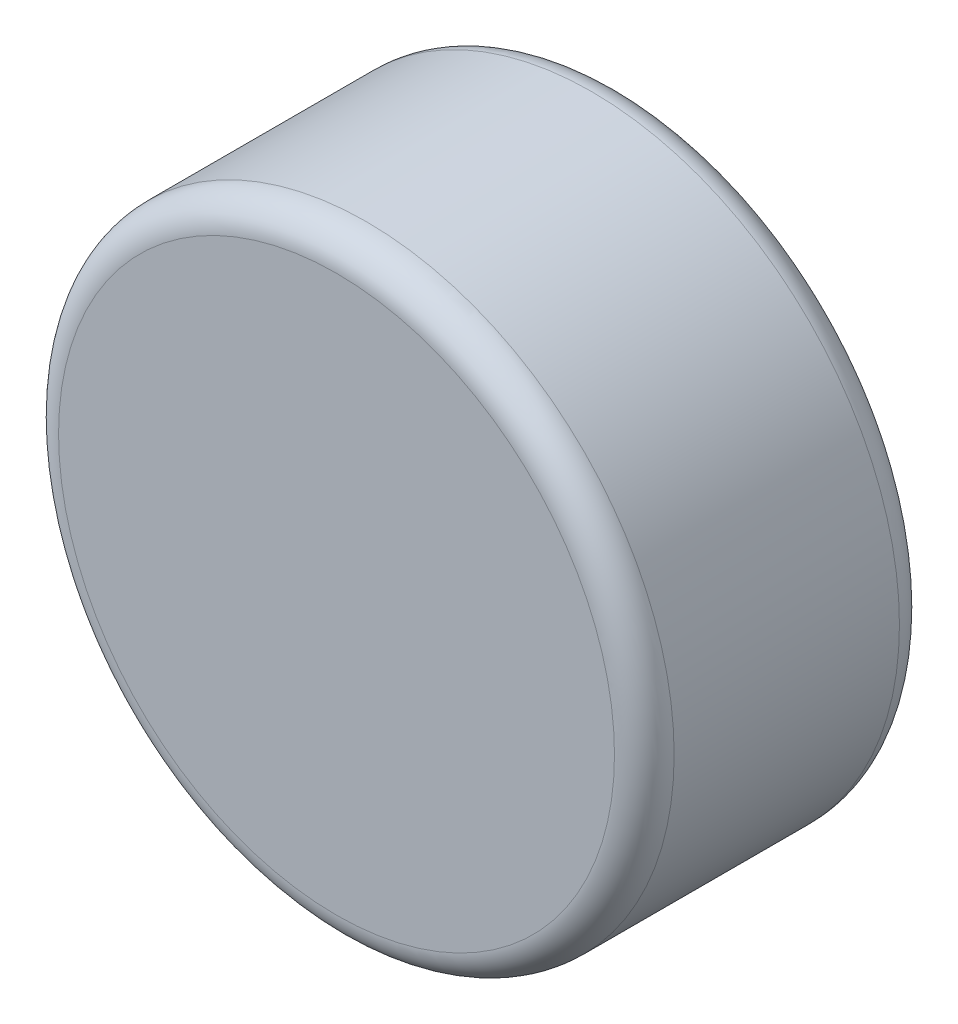
ISO-10303-21;
HEADER;
FILE_DESCRIPTION(('STEP AP214'),'2;1');
FILE_NAME('part.step','',(''),(''),'','','');
FILE_SCHEMA(('AUTOMOTIVE_DESIGN { 1 0 10303 214 1 1 1 1 }'));
ENDSEC;
DATA;
#1=APPLICATION_CONTEXT('core data for automotive mechanical design processes');
#2=APPLICATION_PROTOCOL_DEFINITION('international standard','automotive_design',2000,#1);
#3=PRODUCT_CONTEXT('',#1,'mechanical');
#4=PRODUCT('Part','Part','',(#3));
#5=PRODUCT_RELATED_PRODUCT_CATEGORY('part','',(#4));
#6=PRODUCT_DEFINITION_FORMATION('','',#4);
#7=PRODUCT_DEFINITION_CONTEXT('part definition',#1,'design');
#8=PRODUCT_DEFINITION('design','',#6,#7);
#9=PRODUCT_DEFINITION_SHAPE('','',#8);
#10=(LENGTH_UNIT() NAMED_UNIT(*) SI_UNIT(.MILLI.,.METRE.));
#11=(NAMED_UNIT(*) PLANE_ANGLE_UNIT() SI_UNIT($,.RADIAN.));
#12=(NAMED_UNIT(*) SI_UNIT($,.STERADIAN.) SOLID_ANGLE_UNIT());
#13=UNCERTAINTY_MEASURE_WITH_UNIT(LENGTH_MEASURE(1.E-05),#10,'distance_accuracy_value','');
#14=(GEOMETRIC_REPRESENTATION_CONTEXT(3) GLOBAL_UNCERTAINTY_ASSIGNED_CONTEXT((#13)) GLOBAL_UNIT_ASSIGNED_CONTEXT((#10,
#11,#12)) REPRESENTATION_CONTEXT('',''));
#15=CARTESIAN_POINT('',(0.,0.,0.));
#16=DIRECTION('',(0.,0.,1.));
#17=DIRECTION('',(1.,0.,0.));
#18=AXIS2_PLACEMENT_3D('',#15,#16,#17);
#19=CARTESIAN_POINT('',(0.,0.,0.));
#20=DIRECTION('',(0.,0.,1.));
#21=DIRECTION('',(1.,0.,0.));
#22=AXIS2_PLACEMENT_3D('',#19,#20,#21);
#23=PLANE('',#22);
#24=CARTESIAN_POINT('',(0.,0.,0.));
#25=DIRECTION('',(0.,0.,1.));
#26=DIRECTION('',(1.,0.,0.));
#27=AXIS2_PLACEMENT_3D('',#24,#25,#26);
#28=CIRCLE('',#27,43.8);
#29=CARTESIAN_POINT('',(43.8,0.,0.));
#30=VERTEX_POINT('',#29);
#31=EDGE_CURVE('E54',#30,#30,#28,.T.);
#32=ORIENTED_EDGE('',*,*,#31,.T.);
#33=EDGE_LOOP('',(#32));
#34=FACE_BOUND('',#33,.T.);
#35=ADVANCED_FACE('F39',(#34),#23,.T.);
#36=CARTESIAN_POINT('',(0.,0.,0.));
#37=DIRECTION('',(0.,0.,1.));
#38=DIRECTION('',(1.,0.,0.));
#39=AXIS2_PLACEMENT_3D('',#36,#37,#38);
#40=CYLINDRICAL_SURFACE('',#39,48.5);
#41=CARTESIAN_POINT('',(0.,0.,-4.7));
#42=DIRECTION('',(0.,0.,1.));
#43=DIRECTION('',(1.,0.,0.));
#44=AXIS2_PLACEMENT_3D('',#41,#42,#43);
#45=CIRCLE('',#44,48.5);
#46=CARTESIAN_POINT('',(48.5,0.,-4.7));
#47=VERTEX_POINT('',#46);
#48=EDGE_CURVE('E46',#47,#47,#45,.F.);
#49=ORIENTED_EDGE('',*,*,#48,.T.);
#50=EDGE_LOOP('',(#49));
#51=FACE_BOUND('',#50,.T.);
#52=CARTESIAN_POINT('',(0.,0.,-40.2));
#53=DIRECTION('',(0.,0.,-1.));
#54=DIRECTION('',(-1.,0.,0.));
#55=AXIS2_PLACEMENT_3D('',#52,#53,#54);
#56=CIRCLE('',#55,48.5);
#57=CARTESIAN_POINT('',(-48.5,0.,-40.2));
#58=VERTEX_POINT('',#57);
#59=EDGE_CURVE('E50',#58,#58,#56,.F.);
#60=ORIENTED_EDGE('',*,*,#59,.T.);
#61=EDGE_LOOP('',(#60));
#62=FACE_BOUND('',#61,.T.);
#63=ADVANCED_FACE('F76',(#51,#62),#40,.T.);
#64=CARTESIAN_POINT('',(48.5,0.,-44.9));
#65=DIRECTION('',(0.,0.,-1.));
#66=DIRECTION('',(-1.,0.,0.));
#67=AXIS2_PLACEMENT_3D('',#64,#65,#66);
#68=PLANE('',#67);
#69=CARTESIAN_POINT('',(0.,0.,-44.9));
#70=DIRECTION('',(0.,0.,-1.));
#71=DIRECTION('',(-1.,0.,0.));
#72=AXIS2_PLACEMENT_3D('',#69,#70,#71);
#73=CIRCLE('',#72,43.8);
#74=CARTESIAN_POINT('',(-43.8,0.,-44.9));
#75=VERTEX_POINT('',#74);
#76=EDGE_CURVE('E10',#75,#75,#73,.T.);
#77=ORIENTED_EDGE('',*,*,#76,.T.);
#78=EDGE_LOOP('',(#77));
#79=FACE_BOUND('',#78,.T.);
#80=CARTESIAN_POINT('',(0.,0.,-44.9));
#81=DIRECTION('',(0.,0.,-1.));
#82=DIRECTION('',(-1.,0.,0.));
#83=AXIS2_PLACEMENT_3D('',#80,#81,#82);
#84=CIRCLE('',#83,4.125);
#85=CARTESIAN_POINT('',(-4.125,0.,-44.9));
#86=VERTEX_POINT('',#85);
#87=EDGE_CURVE('E60',#86,#86,#84,.T.);
#88=ORIENTED_EDGE('',*,*,#87,.F.);
#89=EDGE_LOOP('',(#88));
#90=FACE_BOUND('',#89,.T.);
#91=ADVANCED_FACE('F71',(#79,#90),#68,.T.);
#92=CARTESIAN_POINT('',(0.,0.,-18.5));
#93=DIRECTION('',(0.,0.,-1.));
#94=DIRECTION('',(-1.,0.,0.));
#95=AXIS2_PLACEMENT_3D('',#92,#93,#94);
#96=CYLINDRICAL_SURFACE('',#95,4.125);
#97=CARTESIAN_POINT('',(0.,0.,-18.5));
#98=DIRECTION('',(0.,0.,-1.));
#99=DIRECTION('',(-1.,0.,0.));
#100=AXIS2_PLACEMENT_3D('',#97,#98,#99);
#101=CIRCLE('',#100,4.125);
#102=CARTESIAN_POINT('',(-4.125,0.,-18.5));
#103=VERTEX_POINT('',#102);
#104=EDGE_CURVE('E59',#103,#103,#101,.T.);
#105=ORIENTED_EDGE('',*,*,#104,.F.);
#106=EDGE_LOOP('',(#105));
#107=FACE_BOUND('',#106,.T.);
#108=ORIENTED_EDGE('',*,*,#87,.T.);
#109=EDGE_LOOP('',(#108));
#110=FACE_BOUND('',#109,.T.);
#111=ADVANCED_FACE('F68',(#107,#110),#96,.F.);
#112=CARTESIAN_POINT('',(0.,0.,-18.5));
#113=DIRECTION('',(0.,0.,-1.));
#114=DIRECTION('',(-1.,0.,0.));
#115=AXIS2_PLACEMENT_3D('',#112,#113,#114);
#116=PLANE('',#115);
#117=ORIENTED_EDGE('',*,*,#104,.T.);
#118=EDGE_LOOP('',(#117));
#119=FACE_BOUND('',#118,.T.);
#120=ADVANCED_FACE('F66',(#119),#116,.T.);
#121=CARTESIAN_POINT('',(0.,0.,-4.7));
#122=DIRECTION('',(0.,0.,1.));
#123=DIRECTION('',(1.,0.,0.));
#124=AXIS2_PLACEMENT_3D('',#121,#122,#123);
#125=TOROIDAL_SURFACE('',#124,43.8,4.7);
#126=ORIENTED_EDGE('',*,*,#48,.F.);
#127=EDGE_LOOP('',(#126));
#128=FACE_BOUND('',#127,.T.);
#129=ORIENTED_EDGE('',*,*,#31,.F.);
#130=EDGE_LOOP('',(#129));
#131=FACE_BOUND('',#130,.T.);
#132=ADVANCED_FACE('F89',(#128,#131),#125,.T.);
#133=CARTESIAN_POINT('',(0.,0.,-40.2));
#134=DIRECTION('',(0.,0.,-1.));
#135=DIRECTION('',(-1.,0.,0.));
#136=AXIS2_PLACEMENT_3D('',#133,#134,#135);
#137=TOROIDAL_SURFACE('',#136,43.8,4.7);
#138=ORIENTED_EDGE('',*,*,#76,.F.);
#139=EDGE_LOOP('',(#138));
#140=FACE_BOUND('',#139,.T.);
#141=ORIENTED_EDGE('',*,*,#59,.F.);
#142=EDGE_LOOP('',(#141));
#143=FACE_BOUND('',#142,.T.);
#144=ADVANCED_FACE('F41',(#140,#143),#137,.T.);
#145=CLOSED_SHELL('',(#35,#63,#91,#111,#120,#132,#144));
#146=MANIFOLD_SOLID_BREP('B2',#145);
#147=ADVANCED_BREP_SHAPE_REPRESENTATION('',(#18,#146),#14);
#148=SHAPE_DEFINITION_REPRESENTATION(#9,#147);
ENDSEC;
END-ISO-10303-21;
